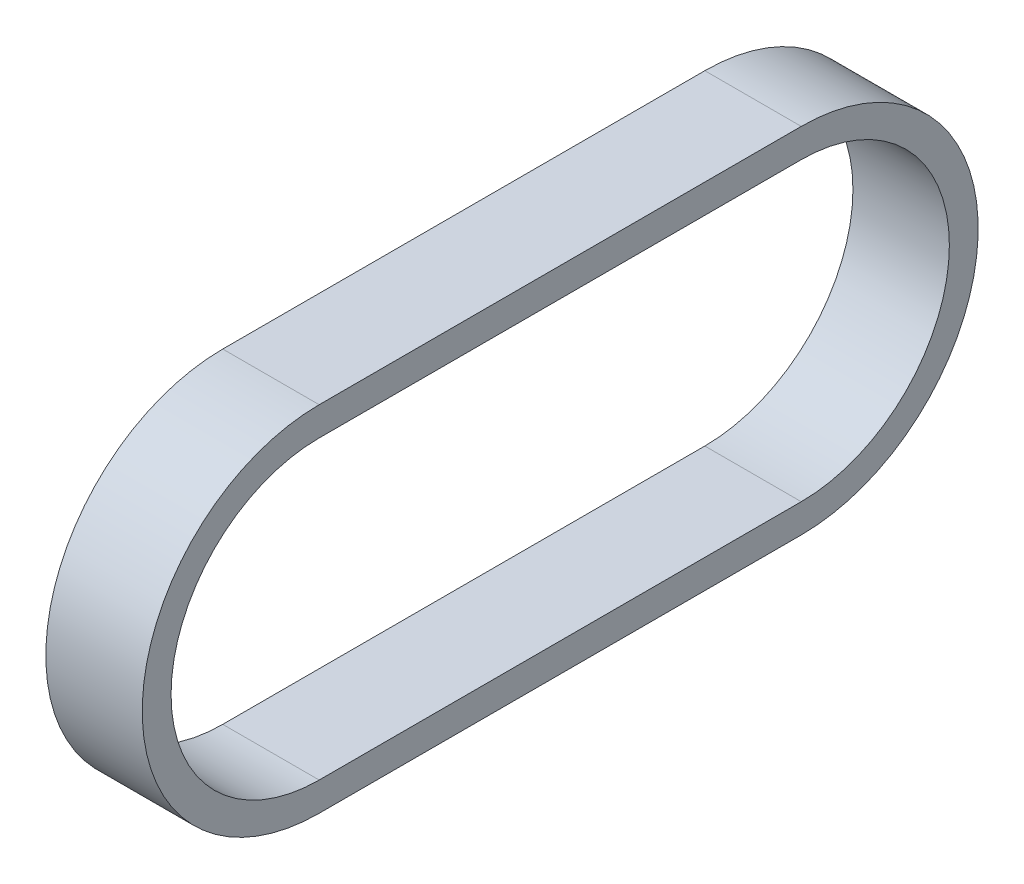
ISO-10303-21;
HEADER;
FILE_DESCRIPTION(('STEP AP214'),'2;1');
FILE_NAME('part.step','',(''),(''),'','','');
FILE_SCHEMA(('AUTOMOTIVE_DESIGN { 1 0 10303 214 1 1 1 1 }'));
ENDSEC;
DATA;
#1=APPLICATION_CONTEXT('core data for automotive mechanical design processes');
#2=APPLICATION_PROTOCOL_DEFINITION('international standard','automotive_design',2000,#1);
#3=PRODUCT_CONTEXT('',#1,'mechanical');
#4=PRODUCT('Part','Part','',(#3));
#5=PRODUCT_RELATED_PRODUCT_CATEGORY('part','',(#4));
#6=PRODUCT_DEFINITION_FORMATION('','',#4);
#7=PRODUCT_DEFINITION_CONTEXT('part definition',#1,'design');
#8=PRODUCT_DEFINITION('design','',#6,#7);
#9=PRODUCT_DEFINITION_SHAPE('','',#8);
#10=(LENGTH_UNIT() NAMED_UNIT(*) SI_UNIT(.MILLI.,.METRE.));
#11=(NAMED_UNIT(*) PLANE_ANGLE_UNIT() SI_UNIT($,.RADIAN.));
#12=(NAMED_UNIT(*) SI_UNIT($,.STERADIAN.) SOLID_ANGLE_UNIT());
#13=UNCERTAINTY_MEASURE_WITH_UNIT(LENGTH_MEASURE(1.E-05),#10,'distance_accuracy_value','');
#14=(GEOMETRIC_REPRESENTATION_CONTEXT(3) GLOBAL_UNCERTAINTY_ASSIGNED_CONTEXT((#13)) GLOBAL_UNIT_ASSIGNED_CONTEXT((#10,
#11,#12)) REPRESENTATION_CONTEXT('',''));
#15=CARTESIAN_POINT('',(0.,0.,0.));
#16=DIRECTION('',(0.,0.,1.));
#17=DIRECTION('',(1.,0.,0.));
#18=AXIS2_PLACEMENT_3D('',#15,#16,#17);
#19=CARTESIAN_POINT('',(8.5,0.,21.2471));
#20=DIRECTION('',(1.,0.,0.));
#21=DIRECTION('',(0.,0.,-1.));
#22=AXIS2_PLACEMENT_3D('',#19,#20,#21);
#23=PLANE('',#22);
#24=CARTESIAN_POINT('',(8.5,0.,21.2471));
#25=DIRECTION('',(1.,0.,0.));
#26=DIRECTION('',(0.,0.,-1.));
#27=AXIS2_PLACEMENT_3D('',#24,#25,#26);
#28=CIRCLE('',#27,15.5956);
#29=CARTESIAN_POINT('',(8.5,15.5956,21.2471));
#30=VERTEX_POINT('',#29);
#31=CARTESIAN_POINT('',(8.5,-15.5956,21.2471));
#32=VERTEX_POINT('',#31);
#33=EDGE_CURVE('E164',#30,#32,#28,.T.);
#34=ORIENTED_EDGE('',*,*,#33,.T.);
#35=DIRECTION('',(0.,0.,-1.));
#36=VECTOR('',#35,1.);
#37=CARTESIAN_POINT('',(8.5,-15.5956,21.2471));
#38=LINE('',#37,#36);
#39=CARTESIAN_POINT('',(8.5,-15.5956,-21.2471));
#40=VERTEX_POINT('',#39);
#41=EDGE_CURVE('E167',#32,#40,#38,.T.);
#42=ORIENTED_EDGE('',*,*,#41,.T.);
#43=CARTESIAN_POINT('',(8.5,0.,-21.2471));
#44=DIRECTION('',(1.,0.,0.));
#45=DIRECTION('',(0.,0.,-1.));
#46=AXIS2_PLACEMENT_3D('',#43,#44,#45);
#47=CIRCLE('',#46,15.5956);
#48=CARTESIAN_POINT('',(8.5,15.5956,-21.2471));
#49=VERTEX_POINT('',#48);
#50=EDGE_CURVE('E170',#40,#49,#47,.T.);
#51=ORIENTED_EDGE('',*,*,#50,.T.);
#52=DIRECTION('',(0.,0.,1.));
#53=VECTOR('',#52,1.);
#54=CARTESIAN_POINT('',(8.5,15.5956,21.2471));
#55=LINE('',#54,#53);
#56=EDGE_CURVE('E172',#49,#30,#55,.T.);
#57=ORIENTED_EDGE('',*,*,#56,.T.);
#58=EDGE_LOOP('',(#34,#42,#51,#57));
#59=FACE_BOUND('',#58,.T.);
#60=DIRECTION('',(0.,0.,-1.));
#61=VECTOR('',#60,1.);
#62=CARTESIAN_POINT('',(8.5,-13.0556,21.2471));
#63=LINE('',#62,#61);
#64=CARTESIAN_POINT('',(8.5,-13.0556,21.2471));
#65=VERTEX_POINT('',#64);
#66=CARTESIAN_POINT('',(8.5,-13.0556,-21.2471));
#67=VERTEX_POINT('',#66);
#68=EDGE_CURVE('E136',#65,#67,#63,.T.);
#69=ORIENTED_EDGE('',*,*,#68,.F.);
#70=CARTESIAN_POINT('',(8.5,0.,21.2471));
#71=DIRECTION('',(1.,0.,0.));
#72=DIRECTION('',(0.,0.,-1.));
#73=AXIS2_PLACEMENT_3D('',#70,#71,#72);
#74=CIRCLE('',#73,13.0556);
#75=CARTESIAN_POINT('',(8.5,13.0556,21.2471));
#76=VERTEX_POINT('',#75);
#77=EDGE_CURVE('E128',#76,#65,#74,.T.);
#78=ORIENTED_EDGE('',*,*,#77,.F.);
#79=DIRECTION('',(0.,0.,1.));
#80=VECTOR('',#79,1.);
#81=CARTESIAN_POINT('',(8.5,13.0556,21.2471));
#82=LINE('',#81,#80);
#83=CARTESIAN_POINT('',(8.5,13.0556,-21.2471));
#84=VERTEX_POINT('',#83);
#85=EDGE_CURVE('E150',#84,#76,#82,.T.);
#86=ORIENTED_EDGE('',*,*,#85,.F.);
#87=CARTESIAN_POINT('',(8.5,0.,-21.2471));
#88=DIRECTION('',(1.,0.,0.));
#89=DIRECTION('',(0.,0.,-1.));
#90=AXIS2_PLACEMENT_3D('',#87,#88,#89);
#91=CIRCLE('',#90,13.0556);
#92=EDGE_CURVE('E148',#67,#84,#91,.T.);
#93=ORIENTED_EDGE('',*,*,#92,.F.);
#94=EDGE_LOOP('',(#69,#78,#86,#93));
#95=FACE_BOUND('',#94,.T.);
#96=ADVANCED_FACE('F63',(#59,#95),#23,.T.);
#97=CARTESIAN_POINT('',(0.,0.,21.2471));
#98=DIRECTION('',(1.,0.,0.));
#99=DIRECTION('',(0.,0.,-1.));
#100=AXIS2_PLACEMENT_3D('',#97,#98,#99);
#101=PLANE('',#100);
#102=CARTESIAN_POINT('',(0.,0.,21.2471));
#103=DIRECTION('',(1.,0.,0.));
#104=DIRECTION('',(0.,0.,-1.));
#105=AXIS2_PLACEMENT_3D('',#102,#103,#104);
#106=CIRCLE('',#105,15.5956);
#107=CARTESIAN_POINT('',(0.,15.5956,21.2471));
#108=VERTEX_POINT('',#107);
#109=CARTESIAN_POINT('',(0.,-15.5956,21.2471));
#110=VERTEX_POINT('',#109);
#111=EDGE_CURVE('E144',#108,#110,#106,.T.);
#112=ORIENTED_EDGE('',*,*,#111,.F.);
#113=DIRECTION('',(0.,0.,1.));
#114=VECTOR('',#113,1.);
#115=CARTESIAN_POINT('',(0.,15.5956,21.2471));
#116=LINE('',#115,#114);
#117=CARTESIAN_POINT('',(0.,15.5956,-21.2471));
#118=VERTEX_POINT('',#117);
#119=EDGE_CURVE('E168',#118,#108,#116,.T.);
#120=ORIENTED_EDGE('',*,*,#119,.F.);
#121=CARTESIAN_POINT('',(0.,0.,-21.2471));
#122=DIRECTION('',(1.,0.,0.));
#123=DIRECTION('',(0.,0.,-1.));
#124=AXIS2_PLACEMENT_3D('',#121,#122,#123);
#125=CIRCLE('',#124,15.5956);
#126=CARTESIAN_POINT('',(0.,-15.5956,-21.2471));
#127=VERTEX_POINT('',#126);
#128=EDGE_CURVE('E179',#127,#118,#125,.T.);
#129=ORIENTED_EDGE('',*,*,#128,.F.);
#130=DIRECTION('',(0.,0.,-1.));
#131=VECTOR('',#130,1.);
#132=CARTESIAN_POINT('',(0.,-15.5956,21.2471));
#133=LINE('',#132,#131);
#134=EDGE_CURVE('E177',#110,#127,#133,.T.);
#135=ORIENTED_EDGE('',*,*,#134,.F.);
#136=EDGE_LOOP('',(#112,#120,#129,#135));
#137=FACE_BOUND('',#136,.T.);
#138=CARTESIAN_POINT('',(0.,0.,21.2471));
#139=DIRECTION('',(1.,0.,0.));
#140=DIRECTION('',(0.,0.,-1.));
#141=AXIS2_PLACEMENT_3D('',#138,#139,#140);
#142=CIRCLE('',#141,13.0556);
#143=CARTESIAN_POINT('',(0.,13.0556,21.2471));
#144=VERTEX_POINT('',#143);
#145=CARTESIAN_POINT('',(0.,-13.0556,21.2471));
#146=VERTEX_POINT('',#145);
#147=EDGE_CURVE('E86',#144,#146,#142,.T.);
#148=ORIENTED_EDGE('',*,*,#147,.T.);
#149=DIRECTION('',(0.,0.,-1.));
#150=VECTOR('',#149,1.);
#151=CARTESIAN_POINT('',(0.,-13.0556,21.2471));
#152=LINE('',#151,#150);
#153=CARTESIAN_POINT('',(0.,-13.0556,-21.2471));
#154=VERTEX_POINT('',#153);
#155=EDGE_CURVE('E143',#146,#154,#152,.T.);
#156=ORIENTED_EDGE('',*,*,#155,.T.);
#157=CARTESIAN_POINT('',(0.,0.,-21.2471));
#158=DIRECTION('',(1.,0.,0.));
#159=DIRECTION('',(0.,0.,-1.));
#160=AXIS2_PLACEMENT_3D('',#157,#158,#159);
#161=CIRCLE('',#160,13.0556);
#162=CARTESIAN_POINT('',(0.,13.0556,-21.2471));
#163=VERTEX_POINT('',#162);
#164=EDGE_CURVE('E156',#154,#163,#161,.T.);
#165=ORIENTED_EDGE('',*,*,#164,.T.);
#166=DIRECTION('',(0.,0.,1.));
#167=VECTOR('',#166,1.);
#168=CARTESIAN_POINT('',(0.,13.0556,21.2471));
#169=LINE('',#168,#167);
#170=EDGE_CURVE('E137',#163,#144,#169,.T.);
#171=ORIENTED_EDGE('',*,*,#170,.T.);
#172=EDGE_LOOP('',(#148,#156,#165,#171));
#173=FACE_BOUND('',#172,.T.);
#174=ADVANCED_FACE('F197',(#137,#173),#101,.F.);
#175=CARTESIAN_POINT('',(8.5,0.,21.2471));
#176=DIRECTION('',(-1.,0.,0.));
#177=DIRECTION('',(0.,0.,1.));
#178=AXIS2_PLACEMENT_3D('',#175,#176,#177);
#179=CYLINDRICAL_SURFACE('',#178,15.5956);
#180=ORIENTED_EDGE('',*,*,#111,.T.);
#181=DIRECTION('',(-1.,0.,0.));
#182=VECTOR('',#181,1.);
#183=CARTESIAN_POINT('',(8.5,-15.5956,21.2471));
#184=LINE('',#183,#182);
#185=EDGE_CURVE('E12',#32,#110,#184,.T.);
#186=ORIENTED_EDGE('',*,*,#185,.F.);
#187=ORIENTED_EDGE('',*,*,#33,.F.);
#188=DIRECTION('',(-1.,0.,0.));
#189=VECTOR('',#188,1.);
#190=CARTESIAN_POINT('',(8.5,15.5956,21.2471));
#191=LINE('',#190,#189);
#192=EDGE_CURVE('E174',#30,#108,#191,.T.);
#193=ORIENTED_EDGE('',*,*,#192,.T.);
#194=EDGE_LOOP('',(#180,#186,#187,#193));
#195=FACE_BOUND('',#194,.T.);
#196=ADVANCED_FACE('F65',(#195),#179,.T.);
#197=CARTESIAN_POINT('',(8.5,-15.5956,21.2471));
#198=DIRECTION('',(0.,1.,0.));
#199=DIRECTION('',(0.,0.,1.));
#200=AXIS2_PLACEMENT_3D('',#197,#198,#199);
#201=PLANE('',#200);
#202=ORIENTED_EDGE('',*,*,#134,.T.);
#203=DIRECTION('',(-1.,0.,0.));
#204=VECTOR('',#203,1.);
#205=CARTESIAN_POINT('',(8.5,-15.5956,-21.2471));
#206=LINE('',#205,#204);
#207=EDGE_CURVE('E71',#40,#127,#206,.T.);
#208=ORIENTED_EDGE('',*,*,#207,.F.);
#209=ORIENTED_EDGE('',*,*,#41,.F.);
#210=ORIENTED_EDGE('',*,*,#185,.T.);
#211=EDGE_LOOP('',(#202,#208,#209,#210));
#212=FACE_BOUND('',#211,.T.);
#213=ADVANCED_FACE('F207',(#212),#201,.F.);
#214=CARTESIAN_POINT('',(8.5,0.,-21.2471));
#215=DIRECTION('',(-1.,0.,0.));
#216=DIRECTION('',(0.,0.,1.));
#217=AXIS2_PLACEMENT_3D('',#214,#215,#216);
#218=CYLINDRICAL_SURFACE('',#217,15.5956);
#219=ORIENTED_EDGE('',*,*,#128,.T.);
#220=DIRECTION('',(-1.,0.,0.));
#221=VECTOR('',#220,1.);
#222=CARTESIAN_POINT('',(8.5,15.5956,-21.2471));
#223=LINE('',#222,#221);
#224=EDGE_CURVE('E184',#49,#118,#223,.T.);
#225=ORIENTED_EDGE('',*,*,#224,.F.);
#226=ORIENTED_EDGE('',*,*,#50,.F.);
#227=ORIENTED_EDGE('',*,*,#207,.T.);
#228=EDGE_LOOP('',(#219,#225,#226,#227));
#229=FACE_BOUND('',#228,.T.);
#230=ADVANCED_FACE('F191',(#229),#218,.T.);
#231=CARTESIAN_POINT('',(8.5,15.5956,21.2471));
#232=DIRECTION('',(0.,-1.,0.));
#233=DIRECTION('',(0.,0.,-1.));
#234=AXIS2_PLACEMENT_3D('',#231,#232,#233);
#235=PLANE('',#234);
#236=ORIENTED_EDGE('',*,*,#119,.T.);
#237=ORIENTED_EDGE('',*,*,#192,.F.);
#238=ORIENTED_EDGE('',*,*,#56,.F.);
#239=ORIENTED_EDGE('',*,*,#224,.T.);
#240=EDGE_LOOP('',(#236,#237,#238,#239));
#241=FACE_BOUND('',#240,.T.);
#242=ADVANCED_FACE('F201',(#241),#235,.F.);
#243=CARTESIAN_POINT('',(8.5,0.,21.2471));
#244=DIRECTION('',(-1.,0.,0.));
#245=DIRECTION('',(0.,0.,1.));
#246=AXIS2_PLACEMENT_3D('',#243,#244,#245);
#247=CYLINDRICAL_SURFACE('',#246,13.0556);
#248=ORIENTED_EDGE('',*,*,#147,.F.);
#249=DIRECTION('',(-1.,0.,0.));
#250=VECTOR('',#249,1.);
#251=CARTESIAN_POINT('',(8.5,13.0556,21.2471));
#252=LINE('',#251,#250);
#253=EDGE_CURVE('E132',#76,#144,#252,.T.);
#254=ORIENTED_EDGE('',*,*,#253,.F.);
#255=ORIENTED_EDGE('',*,*,#77,.T.);
#256=DIRECTION('',(-1.,0.,0.));
#257=VECTOR('',#256,1.);
#258=CARTESIAN_POINT('',(8.5,-13.0556,21.2471));
#259=LINE('',#258,#257);
#260=EDGE_CURVE('E131',#65,#146,#259,.T.);
#261=ORIENTED_EDGE('',*,*,#260,.T.);
#262=EDGE_LOOP('',(#248,#254,#255,#261));
#263=FACE_BOUND('',#262,.T.);
#264=ADVANCED_FACE('F130',(#263),#247,.F.);
#265=CARTESIAN_POINT('',(8.5,-13.0556,21.2471));
#266=DIRECTION('',(0.,1.,0.));
#267=DIRECTION('',(0.,0.,1.));
#268=AXIS2_PLACEMENT_3D('',#265,#266,#267);
#269=PLANE('',#268);
#270=ORIENTED_EDGE('',*,*,#155,.F.);
#271=ORIENTED_EDGE('',*,*,#260,.F.);
#272=ORIENTED_EDGE('',*,*,#68,.T.);
#273=DIRECTION('',(-1.,0.,0.));
#274=VECTOR('',#273,1.);
#275=CARTESIAN_POINT('',(8.5,-13.0556,-21.2471));
#276=LINE('',#275,#274);
#277=EDGE_CURVE('E145',#67,#154,#276,.T.);
#278=ORIENTED_EDGE('',*,*,#277,.T.);
#279=EDGE_LOOP('',(#270,#271,#272,#278));
#280=FACE_BOUND('',#279,.T.);
#281=ADVANCED_FACE('F140',(#280),#269,.T.);
#282=CARTESIAN_POINT('',(8.5,0.,-21.2471));
#283=DIRECTION('',(-1.,0.,0.));
#284=DIRECTION('',(0.,0.,1.));
#285=AXIS2_PLACEMENT_3D('',#282,#283,#284);
#286=CYLINDRICAL_SURFACE('',#285,13.0556);
#287=ORIENTED_EDGE('',*,*,#164,.F.);
#288=ORIENTED_EDGE('',*,*,#277,.F.);
#289=ORIENTED_EDGE('',*,*,#92,.T.);
#290=DIRECTION('',(-1.,0.,0.));
#291=VECTOR('',#290,1.);
#292=CARTESIAN_POINT('',(8.5,13.0556,-21.2471));
#293=LINE('',#292,#291);
#294=EDGE_CURVE('E78',#84,#163,#293,.T.);
#295=ORIENTED_EDGE('',*,*,#294,.T.);
#296=EDGE_LOOP('',(#287,#288,#289,#295));
#297=FACE_BOUND('',#296,.T.);
#298=ADVANCED_FACE('F230',(#297),#286,.F.);
#299=CARTESIAN_POINT('',(8.5,13.0556,21.2471));
#300=DIRECTION('',(0.,-1.,0.));
#301=DIRECTION('',(0.,0.,-1.));
#302=AXIS2_PLACEMENT_3D('',#299,#300,#301);
#303=PLANE('',#302);
#304=ORIENTED_EDGE('',*,*,#170,.F.);
#305=ORIENTED_EDGE('',*,*,#294,.F.);
#306=ORIENTED_EDGE('',*,*,#85,.T.);
#307=ORIENTED_EDGE('',*,*,#253,.T.);
#308=EDGE_LOOP('',(#304,#305,#306,#307));
#309=FACE_BOUND('',#308,.T.);
#310=ADVANCED_FACE('F234',(#309),#303,.T.);
#311=CLOSED_SHELL('',(#96,#174,#196,#213,#230,#242,#264,#281,#298,#310));
#312=MANIFOLD_SOLID_BREP('B2',#311);
#313=ADVANCED_BREP_SHAPE_REPRESENTATION('',(#18,#312),#14);
#314=SHAPE_DEFINITION_REPRESENTATION(#9,#313);
ENDSEC;
END-ISO-10303-21;
